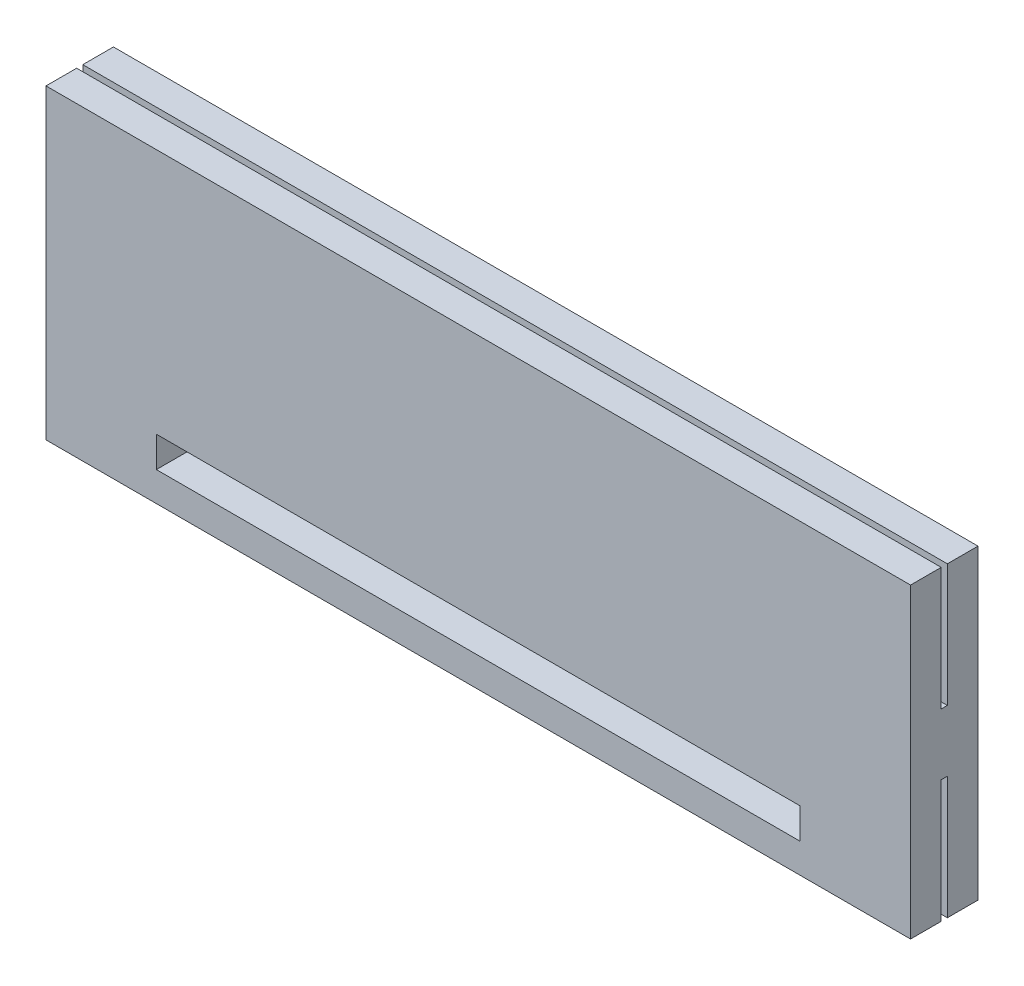
ISO-10303-21;
HEADER;
FILE_DESCRIPTION(('STEP AP214'),'2;1');
FILE_NAME('part.step','',(''),(''),'','','');
FILE_SCHEMA(('AUTOMOTIVE_DESIGN { 1 0 10303 214 1 1 1 1 }'));
ENDSEC;
DATA;
#1=APPLICATION_CONTEXT('core data for automotive mechanical design processes');
#2=APPLICATION_PROTOCOL_DEFINITION('international standard','automotive_design',2000,#1);
#3=PRODUCT_CONTEXT('',#1,'mechanical');
#4=PRODUCT('Part','Part','',(#3));
#5=PRODUCT_RELATED_PRODUCT_CATEGORY('part','',(#4));
#6=PRODUCT_DEFINITION_FORMATION('','',#4);
#7=PRODUCT_DEFINITION_CONTEXT('part definition',#1,'design');
#8=PRODUCT_DEFINITION('design','',#6,#7);
#9=PRODUCT_DEFINITION_SHAPE('','',#8);
#10=(LENGTH_UNIT() NAMED_UNIT(*) SI_UNIT(.MILLI.,.METRE.));
#11=(NAMED_UNIT(*) PLANE_ANGLE_UNIT() SI_UNIT($,.RADIAN.));
#12=(NAMED_UNIT(*) SI_UNIT($,.STERADIAN.) SOLID_ANGLE_UNIT());
#13=UNCERTAINTY_MEASURE_WITH_UNIT(LENGTH_MEASURE(1.E-05),#10,'distance_accuracy_value','');
#14=(GEOMETRIC_REPRESENTATION_CONTEXT(3) GLOBAL_UNCERTAINTY_ASSIGNED_CONTEXT((#13)) GLOBAL_UNIT_ASSIGNED_CONTEXT((#10,
#11,#12)) REPRESENTATION_CONTEXT('',''));
#15=CARTESIAN_POINT('',(0.,0.,0.));
#16=DIRECTION('',(0.,0.,1.));
#17=DIRECTION('',(1.,0.,0.));
#18=AXIS2_PLACEMENT_3D('',#15,#16,#17);
#19=CARTESIAN_POINT('',(293.391405889362,-240.,-12.));
#20=DIRECTION('',(0.,1.,0.));
#21=DIRECTION('',(0.,0.,1.));
#22=AXIS2_PLACEMENT_3D('',#19,#20,#21);
#23=PLANE('',#22);
#24=DIRECTION('',(1.,0.,0.));
#25=VECTOR('',#24,1.);
#26=CARTESIAN_POINT('',(293.391405889362,-240.,-2.00000000000019));
#27=LINE('',#26,#25);
#28=CARTESIAN_POINT('',(-141.,-240.,-2.00000000000176));
#29=VERTEX_POINT('',#28);
#30=CARTESIAN_POINT('',(141.,-240.,-2.00000000000019));
#31=VERTEX_POINT('',#30);
#32=EDGE_CURVE('E230',#29,#31,#27,.T.);
#33=ORIENTED_EDGE('',*,*,#32,.F.);
#34=DIRECTION('',(0.,0.,-1.));
#35=VECTOR('',#34,1.);
#36=CARTESIAN_POINT('',(-141.,-240.,-12.));
#37=LINE('',#36,#35);
#38=CARTESIAN_POINT('',(-141.,-240.,-12.));
#39=VERTEX_POINT('',#38);
#40=EDGE_CURVE('E274',#29,#39,#37,.T.);
#41=ORIENTED_EDGE('',*,*,#40,.T.);
#42=DIRECTION('',(-1.,0.,0.));
#43=VECTOR('',#42,1.);
#44=CARTESIAN_POINT('',(293.391405889362,-240.,-12.));
#45=LINE('',#44,#43);
#46=CARTESIAN_POINT('',(141.,-240.,-12.));
#47=VERTEX_POINT('',#46);
#48=EDGE_CURVE('E270',#47,#39,#45,.T.);
#49=ORIENTED_EDGE('',*,*,#48,.F.);
#50=DIRECTION('',(0.,0.,-1.));
#51=VECTOR('',#50,1.);
#52=CARTESIAN_POINT('',(141.,-240.,-12.));
#53=LINE('',#52,#51);
#54=EDGE_CURVE('E291',#31,#47,#53,.T.);
#55=ORIENTED_EDGE('',*,*,#54,.F.);
#56=EDGE_LOOP('',(#33,#41,#49,#55));
#57=FACE_BOUND('',#56,.T.);
#58=ADVANCED_FACE('F33',(#57),#23,.F.);
#59=CARTESIAN_POINT('',(293.391405889362,-140.,-12.));
#60=DIRECTION('',(0.,-1.,0.));
#61=DIRECTION('',(0.,0.,-1.));
#62=AXIS2_PLACEMENT_3D('',#59,#60,#61);
#63=PLANE('',#62);
#64=DIRECTION('',(-1.,0.,0.));
#65=VECTOR('',#64,1.);
#66=CARTESIAN_POINT('',(293.391405889362,-140.,-2.));
#67=LINE('',#66,#65);
#68=CARTESIAN_POINT('',(141.,-140.,-2.));
#69=VERTEX_POINT('',#68);
#70=CARTESIAN_POINT('',(-141.,-140.,-2.));
#71=VERTEX_POINT('',#70);
#72=EDGE_CURVE('E248',#69,#71,#67,.T.);
#73=ORIENTED_EDGE('',*,*,#72,.F.);
#74=DIRECTION('',(0.,0.,1.));
#75=VECTOR('',#74,1.);
#76=CARTESIAN_POINT('',(141.,-140.,-12.));
#77=LINE('',#76,#75);
#78=CARTESIAN_POINT('',(141.,-140.,-12.));
#79=VERTEX_POINT('',#78);
#80=EDGE_CURVE('E281',#79,#69,#77,.T.);
#81=ORIENTED_EDGE('',*,*,#80,.F.);
#82=DIRECTION('',(-1.,0.,0.));
#83=VECTOR('',#82,1.);
#84=CARTESIAN_POINT('',(293.391405889362,-140.,-12.));
#85=LINE('',#84,#83);
#86=CARTESIAN_POINT('',(-141.,-140.,-12.));
#87=VERTEX_POINT('',#86);
#88=EDGE_CURVE('E292',#79,#87,#85,.T.);
#89=ORIENTED_EDGE('',*,*,#88,.T.);
#90=DIRECTION('',(0.,0.,1.));
#91=VECTOR('',#90,1.);
#92=CARTESIAN_POINT('',(-141.,-140.,-12.));
#93=LINE('',#92,#91);
#94=EDGE_CURVE('E263',#87,#71,#93,.T.);
#95=ORIENTED_EDGE('',*,*,#94,.T.);
#96=EDGE_LOOP('',(#73,#81,#89,#95));
#97=FACE_BOUND('',#96,.T.);
#98=ADVANCED_FACE('F339',(#97),#63,.F.);
#99=CARTESIAN_POINT('',(293.391405889362,-140.,-12.));
#100=DIRECTION('',(0.,0.,1.));
#101=DIRECTION('',(0.,-1.,0.));
#102=AXIS2_PLACEMENT_3D('',#99,#100,#101);
#103=PLANE('',#102);
#104=DIRECTION('',(0.,1.,0.));
#105=VECTOR('',#104,1.);
#106=CARTESIAN_POINT('',(105.,-220.386342941198,-12.));
#107=LINE('',#106,#105);
#108=CARTESIAN_POINT('',(105.,-230.386342941199,-12.));
#109=VERTEX_POINT('',#108);
#110=CARTESIAN_POINT('',(105.,-220.386342941198,-12.));
#111=VERTEX_POINT('',#110);
#112=EDGE_CURVE('E189',#109,#111,#107,.T.);
#113=ORIENTED_EDGE('',*,*,#112,.T.);
#114=DIRECTION('',(-1.,0.,0.));
#115=VECTOR('',#114,1.);
#116=CARTESIAN_POINT('',(-105.,-220.386342941199,-12.));
#117=LINE('',#116,#115);
#118=CARTESIAN_POINT('',(-105.,-220.386342941198,-12.));
#119=VERTEX_POINT('',#118);
#120=EDGE_CURVE('E48',#111,#119,#117,.T.);
#121=ORIENTED_EDGE('',*,*,#120,.T.);
#122=DIRECTION('',(0.,-1.,0.));
#123=VECTOR('',#122,1.);
#124=CARTESIAN_POINT('',(-105.,-230.386342941198,-12.));
#125=LINE('',#124,#123);
#126=CARTESIAN_POINT('',(-105.,-230.386342941199,-12.));
#127=VERTEX_POINT('',#126);
#128=EDGE_CURVE('E175',#119,#127,#125,.T.);
#129=ORIENTED_EDGE('',*,*,#128,.T.);
#130=DIRECTION('',(1.,0.,0.));
#131=VECTOR('',#130,1.);
#132=CARTESIAN_POINT('',(105.,-230.386342941199,-12.));
#133=LINE('',#132,#131);
#134=EDGE_CURVE('E183',#127,#109,#133,.T.);
#135=ORIENTED_EDGE('',*,*,#134,.T.);
#136=EDGE_LOOP('',(#113,#121,#129,#135));
#137=FACE_BOUND('',#136,.T.);
#138=DIRECTION('',(0.,1.,0.));
#139=VECTOR('',#138,1.);
#140=CARTESIAN_POINT('',(141.,-140.,-12.));
#141=LINE('',#140,#139);
#142=EDGE_CURVE('E285',#47,#79,#141,.T.);
#143=ORIENTED_EDGE('',*,*,#142,.F.);
#144=ORIENTED_EDGE('',*,*,#48,.T.);
#145=DIRECTION('',(0.,1.,0.));
#146=VECTOR('',#145,1.);
#147=CARTESIAN_POINT('',(-141.,-140.,-12.));
#148=LINE('',#147,#146);
#149=EDGE_CURVE('E267',#39,#87,#148,.T.);
#150=ORIENTED_EDGE('',*,*,#149,.T.);
#151=ORIENTED_EDGE('',*,*,#88,.F.);
#152=EDGE_LOOP('',(#143,#144,#150,#151));
#153=FACE_BOUND('',#152,.T.);
#154=ADVANCED_FACE('F191',(#137,#153),#103,.F.);
#155=CARTESIAN_POINT('',(141.,-140.,0.));
#156=VERTEX_POINT('',#155);
#157=CARTESIAN_POINT('',(141.,-140.,9.99999999999998));
#158=VERTEX_POINT('',#157);
#159=EDGE_CURVE('E284',#156,#158,#77,.T.);
#160=ORIENTED_EDGE('',*,*,#159,.F.);
#161=DIRECTION('',(-1.,0.,0.));
#162=VECTOR('',#161,1.);
#163=CARTESIAN_POINT('',(293.391405889362,-140.,0.));
#164=LINE('',#163,#162);
#165=CARTESIAN_POINT('',(-141.,-140.,0.));
#166=VERTEX_POINT('',#165);
#167=EDGE_CURVE('E257',#156,#166,#164,.T.);
#168=ORIENTED_EDGE('',*,*,#167,.T.);
#169=CARTESIAN_POINT('',(-141.,-140.,9.99999999999998));
#170=VERTEX_POINT('',#169);
#171=EDGE_CURVE('E262',#166,#170,#93,.T.);
#172=ORIENTED_EDGE('',*,*,#171,.T.);
#173=DIRECTION('',(-1.,0.,0.));
#174=VECTOR('',#173,1.);
#175=CARTESIAN_POINT('',(293.391405889362,-140.,9.99999999999998));
#176=LINE('',#175,#174);
#177=EDGE_CURVE('E294',#158,#170,#176,.T.);
#178=ORIENTED_EDGE('',*,*,#177,.F.);
#179=EDGE_LOOP('',(#160,#168,#172,#178));
#180=FACE_BOUND('',#179,.T.);
#181=ADVANCED_FACE('F348',(#180),#63,.F.);
#182=CARTESIAN_POINT('',(293.391405889362,-140.,9.99999999999998));
#183=DIRECTION('',(0.,0.,-1.));
#184=DIRECTION('',(0.,1.,0.));
#185=AXIS2_PLACEMENT_3D('',#182,#183,#184);
#186=PLANE('',#185);
#187=DIRECTION('',(0.,-1.,0.));
#188=VECTOR('',#187,1.);
#189=CARTESIAN_POINT('',(-105.,-230.3863429412,9.99999999999995));
#190=LINE('',#189,#188);
#191=CARTESIAN_POINT('',(-105.,-220.386342941199,9.99999999999996));
#192=VERTEX_POINT('',#191);
#193=CARTESIAN_POINT('',(-105.,-230.386342941199,9.99999999999995));
#194=VERTEX_POINT('',#193);
#195=EDGE_CURVE('E199',#192,#194,#190,.T.);
#196=ORIENTED_EDGE('',*,*,#195,.F.);
#197=DIRECTION('',(-1.,0.,0.));
#198=VECTOR('',#197,1.);
#199=CARTESIAN_POINT('',(-105.,-220.386342941199,9.99999999999995));
#200=LINE('',#199,#198);
#201=CARTESIAN_POINT('',(105.,-220.386342941199,9.99999999999995));
#202=VERTEX_POINT('',#201);
#203=EDGE_CURVE('E202',#202,#192,#200,.T.);
#204=ORIENTED_EDGE('',*,*,#203,.F.);
#205=DIRECTION('',(0.,1.,0.));
#206=VECTOR('',#205,1.);
#207=CARTESIAN_POINT('',(105.,-220.3863429412,9.99999999999995));
#208=LINE('',#207,#206);
#209=CARTESIAN_POINT('',(105.,-230.386342941199,9.99999999999996));
#210=VERTEX_POINT('',#209);
#211=EDGE_CURVE('E204',#210,#202,#208,.T.);
#212=ORIENTED_EDGE('',*,*,#211,.F.);
#213=DIRECTION('',(1.,0.,0.));
#214=VECTOR('',#213,1.);
#215=CARTESIAN_POINT('',(105.,-230.386342941199,9.99999999999995));
#216=LINE('',#215,#214);
#217=EDGE_CURVE('E197',#194,#210,#216,.T.);
#218=ORIENTED_EDGE('',*,*,#217,.F.);
#219=EDGE_LOOP('',(#196,#204,#212,#218));
#220=FACE_BOUND('',#219,.T.);
#221=DIRECTION('',(0.,-1.,0.));
#222=VECTOR('',#221,1.);
#223=CARTESIAN_POINT('',(141.,-140.,9.99999999999998));
#224=LINE('',#223,#222);
#225=CARTESIAN_POINT('',(141.,-240.,9.99999999999995));
#226=VERTEX_POINT('',#225);
#227=EDGE_CURVE('E277',#158,#226,#224,.T.);
#228=ORIENTED_EDGE('',*,*,#227,.F.);
#229=ORIENTED_EDGE('',*,*,#177,.T.);
#230=DIRECTION('',(0.,-1.,0.));
#231=VECTOR('',#230,1.);
#232=CARTESIAN_POINT('',(-141.,-140.,9.99999999999998));
#233=LINE('',#232,#231);
#234=CARTESIAN_POINT('',(-141.,-240.,9.99999999999995));
#235=VERTEX_POINT('',#234);
#236=EDGE_CURVE('E266',#170,#235,#233,.T.);
#237=ORIENTED_EDGE('',*,*,#236,.T.);
#238=DIRECTION('',(-1.,0.,0.));
#239=VECTOR('',#238,1.);
#240=CARTESIAN_POINT('',(293.391405889362,-240.,9.99999999999995));
#241=LINE('',#240,#239);
#242=EDGE_CURVE('E297',#226,#235,#241,.T.);
#243=ORIENTED_EDGE('',*,*,#242,.F.);
#244=EDGE_LOOP('',(#228,#229,#237,#243));
#245=FACE_BOUND('',#244,.T.);
#246=ADVANCED_FACE('F353',(#220,#245),#186,.F.);
#247=CARTESIAN_POINT('',(-141.,-240.,-1.89163709932799E-13));
#248=VERTEX_POINT('',#247);
#249=EDGE_CURVE('E271',#235,#248,#37,.T.);
#250=ORIENTED_EDGE('',*,*,#249,.T.);
#251=DIRECTION('',(1.,0.,0.));
#252=VECTOR('',#251,1.);
#253=CARTESIAN_POINT('',(293.391405889362,-240.,-1.90819582357449E-13));
#254=LINE('',#253,#252);
#255=CARTESIAN_POINT('',(141.,-240.,-1.90819586702168E-13));
#256=VERTEX_POINT('',#255);
#257=EDGE_CURVE('E239',#248,#256,#254,.T.);
#258=ORIENTED_EDGE('',*,*,#257,.T.);
#259=EDGE_CURVE('E288',#226,#256,#53,.T.);
#260=ORIENTED_EDGE('',*,*,#259,.F.);
#261=ORIENTED_EDGE('',*,*,#242,.T.);
#262=EDGE_LOOP('',(#250,#258,#260,#261));
#263=FACE_BOUND('',#262,.T.);
#264=ADVANCED_FACE('F342',(#263),#23,.F.);
#265=CARTESIAN_POINT('',(141.,-180.,-2.));
#266=DIRECTION('',(1.,0.,0.));
#267=DIRECTION('',(0.,0.,-1.));
#268=AXIS2_PLACEMENT_3D('',#265,#266,#267);
#269=PLANE('',#268);
#270=DIRECTION('',(0.,-1.,0.));
#271=VECTOR('',#270,1.);
#272=CARTESIAN_POINT('',(141.,-180.,0.));
#273=LINE('',#272,#271);
#274=CARTESIAN_POINT('',(141.,-200.,0.));
#275=VERTEX_POINT('',#274);
#276=EDGE_CURVE('E242',#275,#256,#273,.T.);
#277=ORIENTED_EDGE('',*,*,#276,.F.);
#278=DIRECTION('',(0.,0.,1.));
#279=VECTOR('',#278,1.);
#280=CARTESIAN_POINT('',(141.,-200.,-2.00000000000008));
#281=LINE('',#280,#279);
#282=CARTESIAN_POINT('',(141.,-200.,-2.00000000000004));
#283=VERTEX_POINT('',#282);
#284=EDGE_CURVE('E237',#283,#275,#281,.T.);
#285=ORIENTED_EDGE('',*,*,#284,.F.);
#286=DIRECTION('',(0.,-1.,0.));
#287=VECTOR('',#286,1.);
#288=CARTESIAN_POINT('',(141.,-180.,-2.));
#289=LINE('',#288,#287);
#290=EDGE_CURVE('E234',#283,#31,#289,.T.);
#291=ORIENTED_EDGE('',*,*,#290,.T.);
#292=ORIENTED_EDGE('',*,*,#54,.T.);
#293=ORIENTED_EDGE('',*,*,#142,.T.);
#294=ORIENTED_EDGE('',*,*,#80,.T.);
#295=DIRECTION('',(0.,-1.,0.));
#296=VECTOR('',#295,1.);
#297=CARTESIAN_POINT('',(141.,-180.,-2.));
#298=LINE('',#297,#296);
#299=CARTESIAN_POINT('',(141.,-180.,-2.));
#300=VERTEX_POINT('',#299);
#301=EDGE_CURVE('E252',#69,#300,#298,.T.);
#302=ORIENTED_EDGE('',*,*,#301,.T.);
#303=DIRECTION('',(0.,0.,-1.));
#304=VECTOR('',#303,1.);
#305=CARTESIAN_POINT('',(141.,-180.,-2.));
#306=LINE('',#305,#304);
#307=CARTESIAN_POINT('',(141.,-180.,0.));
#308=VERTEX_POINT('',#307);
#309=EDGE_CURVE('E255',#308,#300,#306,.T.);
#310=ORIENTED_EDGE('',*,*,#309,.F.);
#311=DIRECTION('',(0.,-1.,0.));
#312=VECTOR('',#311,1.);
#313=CARTESIAN_POINT('',(141.,-180.,0.));
#314=LINE('',#313,#312);
#315=EDGE_CURVE('E260',#156,#308,#314,.T.);
#316=ORIENTED_EDGE('',*,*,#315,.F.);
#317=ORIENTED_EDGE('',*,*,#159,.T.);
#318=ORIENTED_EDGE('',*,*,#227,.T.);
#319=ORIENTED_EDGE('',*,*,#259,.T.);
#320=EDGE_LOOP('',(#277,#285,#291,#292,#293,#294,#302,#310,#316,#317,#318,#319));
#321=FACE_BOUND('',#320,.T.);
#322=ADVANCED_FACE('F35',(#321),#269,.T.);
#323=CARTESIAN_POINT('',(-141.,225.,-2.));
#324=DIRECTION('',(-1.,0.,0.));
#325=DIRECTION('',(0.,0.,1.));
#326=AXIS2_PLACEMENT_3D('',#323,#324,#325);
#327=PLANE('',#326);
#328=DIRECTION('',(0.,1.,0.));
#329=VECTOR('',#328,1.);
#330=CARTESIAN_POINT('',(-141.,225.,1.570792107497E-12));
#331=LINE('',#330,#329);
#332=CARTESIAN_POINT('',(-141.,-200.,0.));
#333=VERTEX_POINT('',#332);
#334=EDGE_CURVE('E313',#248,#333,#331,.T.);
#335=ORIENTED_EDGE('',*,*,#334,.F.);
#336=ORIENTED_EDGE('',*,*,#249,.F.);
#337=ORIENTED_EDGE('',*,*,#236,.F.);
#338=ORIENTED_EDGE('',*,*,#171,.F.);
#339=DIRECTION('',(0.,1.,0.));
#340=VECTOR('',#339,1.);
#341=CARTESIAN_POINT('',(-141.,225.,0.));
#342=LINE('',#341,#340);
#343=CARTESIAN_POINT('',(-141.,-180.,0.));
#344=VERTEX_POINT('',#343);
#345=EDGE_CURVE('E305',#344,#166,#342,.T.);
#346=ORIENTED_EDGE('',*,*,#345,.F.);
#347=DIRECTION('',(0.,0.,1.));
#348=VECTOR('',#347,1.);
#349=CARTESIAN_POINT('',(-141.,-180.,-2.));
#350=LINE('',#349,#348);
#351=CARTESIAN_POINT('',(-141.,-180.,-2.));
#352=VERTEX_POINT('',#351);
#353=EDGE_CURVE('E303',#352,#344,#350,.T.);
#354=ORIENTED_EDGE('',*,*,#353,.F.);
#355=DIRECTION('',(0.,1.,0.));
#356=VECTOR('',#355,1.);
#357=CARTESIAN_POINT('',(-141.,225.,-2.));
#358=LINE('',#357,#356);
#359=EDGE_CURVE('E280',#352,#71,#358,.T.);
#360=ORIENTED_EDGE('',*,*,#359,.T.);
#361=ORIENTED_EDGE('',*,*,#94,.F.);
#362=ORIENTED_EDGE('',*,*,#149,.F.);
#363=ORIENTED_EDGE('',*,*,#40,.F.);
#364=DIRECTION('',(0.,1.,0.));
#365=VECTOR('',#364,1.);
#366=CARTESIAN_POINT('',(-141.,225.,-2.));
#367=LINE('',#366,#365);
#368=CARTESIAN_POINT('',(-141.,-200.,-2.00000000000161));
#369=VERTEX_POINT('',#368);
#370=EDGE_CURVE('E307',#29,#369,#367,.T.);
#371=ORIENTED_EDGE('',*,*,#370,.T.);
#372=DIRECTION('',(0.,0.,-1.));
#373=VECTOR('',#372,1.);
#374=CARTESIAN_POINT('',(-141.,-200.,-2.00000000000161));
#375=LINE('',#374,#373);
#376=EDGE_CURVE('E310',#333,#369,#375,.T.);
#377=ORIENTED_EDGE('',*,*,#376,.F.);
#378=EDGE_LOOP('',(#335,#336,#337,#338,#346,#354,#360,#361,#362,#363,#371,#377));
#379=FACE_BOUND('',#378,.T.);
#380=ADVANCED_FACE('F359',(#379),#327,.T.);
#381=CARTESIAN_POINT('',(0.,0.,0.));
#382=DIRECTION('',(0.,0.,1.));
#383=DIRECTION('',(1.,0.,0.));
#384=AXIS2_PLACEMENT_3D('',#381,#382,#383);
#385=PLANE('',#384);
#386=ORIENTED_EDGE('',*,*,#315,.T.);
#387=DIRECTION('',(1.,0.,0.));
#388=VECTOR('',#387,1.);
#389=CARTESIAN_POINT('',(-191.,-180.,0.));
#390=LINE('',#389,#388);
#391=EDGE_CURVE('E244',#344,#308,#390,.T.);
#392=ORIENTED_EDGE('',*,*,#391,.F.);
#393=ORIENTED_EDGE('',*,*,#345,.T.);
#394=ORIENTED_EDGE('',*,*,#167,.F.);
#395=EDGE_LOOP('',(#386,#392,#393,#394));
#396=FACE_BOUND('',#395,.T.);
#397=ADVANCED_FACE('F378',(#396),#385,.F.);
#398=CARTESIAN_POINT('',(-191.,-180.,-2.));
#399=DIRECTION('',(0.,-1.,0.));
#400=DIRECTION('',(0.,0.,1.));
#401=AXIS2_PLACEMENT_3D('',#398,#399,#400);
#402=PLANE('',#401);
#403=ORIENTED_EDGE('',*,*,#309,.T.);
#404=DIRECTION('',(1.,0.,0.));
#405=VECTOR('',#404,1.);
#406=CARTESIAN_POINT('',(-191.,-180.,-2.));
#407=LINE('',#406,#405);
#408=EDGE_CURVE('E245',#352,#300,#407,.T.);
#409=ORIENTED_EDGE('',*,*,#408,.F.);
#410=ORIENTED_EDGE('',*,*,#353,.T.);
#411=ORIENTED_EDGE('',*,*,#391,.T.);
#412=EDGE_LOOP('',(#403,#409,#410,#411));
#413=FACE_BOUND('',#412,.T.);
#414=ADVANCED_FACE('F382',(#413),#402,.F.);
#415=CARTESIAN_POINT('',(0.,0.,-2.));
#416=DIRECTION('',(0.,0.,1.));
#417=DIRECTION('',(1.,0.,0.));
#418=AXIS2_PLACEMENT_3D('',#415,#416,#417);
#419=PLANE('',#418);
#420=ORIENTED_EDGE('',*,*,#72,.T.);
#421=ORIENTED_EDGE('',*,*,#359,.F.);
#422=ORIENTED_EDGE('',*,*,#408,.T.);
#423=ORIENTED_EDGE('',*,*,#301,.F.);
#424=EDGE_LOOP('',(#420,#421,#422,#423));
#425=FACE_BOUND('',#424,.T.);
#426=ADVANCED_FACE('F387',(#425),#419,.T.);
#427=CARTESIAN_POINT('',(0.,-380.,-7.19121731859478E-13));
#428=DIRECTION('',(0.,0.,1.));
#429=DIRECTION('',(1.,0.,0.));
#430=AXIS2_PLACEMENT_3D('',#427,#428,#429);
#431=PLANE('',#430);
#432=DIRECTION('',(0.,1.,0.));
#433=VECTOR('',#432,1.);
#434=CARTESIAN_POINT('',(105.,-380.,-7.191217288659E-13));
#435=LINE('',#434,#433);
#436=CARTESIAN_POINT('',(105.,-230.386342941199,-1.38777878078145E-13));
#437=VERTEX_POINT('',#436);
#438=CARTESIAN_POINT('',(105.,-220.386342941198,-1.15007784173679E-13));
#439=VERTEX_POINT('',#438);
#440=EDGE_CURVE('E214',#437,#439,#435,.T.);
#441=ORIENTED_EDGE('',*,*,#440,.T.);
#442=DIRECTION('',(-1.,0.,0.));
#443=VECTOR('',#442,1.);
#444=CARTESIAN_POINT('',(0.,-220.386342941199,-1.1500778716726E-13));
#445=LINE('',#444,#443);
#446=CARTESIAN_POINT('',(-105.,-220.386342941199,-1.38777878078145E-13));
#447=VERTEX_POINT('',#446);
#448=EDGE_CURVE('E223',#439,#447,#445,.T.);
#449=ORIENTED_EDGE('',*,*,#448,.T.);
#450=DIRECTION('',(0.,-1.,0.));
#451=VECTOR('',#450,1.);
#452=CARTESIAN_POINT('',(-105.,-380.,-7.19121734853056E-13));
#453=LINE('',#452,#451);
#454=CARTESIAN_POINT('',(-105.,-230.386342941199,-1.66533453693773E-13));
#455=VERTEX_POINT('',#454);
#456=EDGE_CURVE('E220',#447,#455,#453,.T.);
#457=ORIENTED_EDGE('',*,*,#456,.T.);
#458=DIRECTION('',(1.,0.,0.));
#459=VECTOR('',#458,1.);
#460=CARTESIAN_POINT('',(0.,-230.386342941199,-1.52856299370051E-13));
#461=LINE('',#460,#459);
#462=EDGE_CURVE('E217',#455,#437,#461,.T.);
#463=ORIENTED_EDGE('',*,*,#462,.T.);
#464=EDGE_LOOP('',(#441,#449,#457,#463));
#465=FACE_BOUND('',#464,.T.);
#466=ORIENTED_EDGE('',*,*,#276,.T.);
#467=ORIENTED_EDGE('',*,*,#257,.F.);
#468=ORIENTED_EDGE('',*,*,#334,.T.);
#469=DIRECTION('',(1.,0.,0.));
#470=VECTOR('',#469,1.);
#471=CARTESIAN_POINT('',(-191.,-200.,0.));
#472=LINE('',#471,#470);
#473=EDGE_CURVE('E226',#333,#275,#472,.T.);
#474=ORIENTED_EDGE('',*,*,#473,.T.);
#475=EDGE_LOOP('',(#466,#467,#468,#474));
#476=FACE_BOUND('',#475,.T.);
#477=ADVANCED_FACE('F400',(#465,#476),#431,.F.);
#478=CARTESIAN_POINT('',(-191.,-200.,-2.00000000000004));
#479=DIRECTION('',(0.,1.,0.));
#480=DIRECTION('',(0.,0.,1.));
#481=AXIS2_PLACEMENT_3D('',#478,#479,#480);
#482=PLANE('',#481);
#483=ORIENTED_EDGE('',*,*,#284,.T.);
#484=ORIENTED_EDGE('',*,*,#473,.F.);
#485=ORIENTED_EDGE('',*,*,#376,.T.);
#486=DIRECTION('',(1.,0.,0.));
#487=VECTOR('',#486,1.);
#488=CARTESIAN_POINT('',(-191.,-200.,-2.00000000000004));
#489=LINE('',#488,#487);
#490=EDGE_CURVE('E227',#369,#283,#489,.T.);
#491=ORIENTED_EDGE('',*,*,#490,.T.);
#492=EDGE_LOOP('',(#483,#484,#485,#491));
#493=FACE_BOUND('',#492,.T.);
#494=ADVANCED_FACE('F398',(#493),#482,.F.);
#495=CARTESIAN_POINT('',(0.,-380.,-2.00000000000072));
#496=DIRECTION('',(0.,0.,1.));
#497=DIRECTION('',(1.,0.,0.));
#498=AXIS2_PLACEMENT_3D('',#495,#496,#497);
#499=PLANE('',#498);
#500=DIRECTION('',(-1.,0.,0.));
#501=VECTOR('',#500,1.);
#502=CARTESIAN_POINT('',(0.,-220.386342941199,-2.00000000000012));
#503=LINE('',#502,#501);
#504=CARTESIAN_POINT('',(105.,-220.386342941199,-2.00000000000014));
#505=VERTEX_POINT('',#504);
#506=CARTESIAN_POINT('',(-105.,-220.386342941199,-2.00000000000014));
#507=VERTEX_POINT('',#506);
#508=EDGE_CURVE('E11',#505,#507,#503,.T.);
#509=ORIENTED_EDGE('',*,*,#508,.F.);
#510=DIRECTION('',(0.,1.,0.));
#511=VECTOR('',#510,1.);
#512=CARTESIAN_POINT('',(105.,-380.,-2.00000000000072));
#513=LINE('',#512,#511);
#514=CARTESIAN_POINT('',(105.,-230.386342941199,-2.00000000000015));
#515=VERTEX_POINT('',#514);
#516=EDGE_CURVE('E315',#515,#505,#513,.T.);
#517=ORIENTED_EDGE('',*,*,#516,.F.);
#518=DIRECTION('',(1.,0.,0.));
#519=VECTOR('',#518,1.);
#520=CARTESIAN_POINT('',(0.,-230.386342941199,-2.00000000000015));
#521=LINE('',#520,#519);
#522=CARTESIAN_POINT('',(-105.,-230.386342941199,-2.00000000000014));
#523=VERTEX_POINT('',#522);
#524=EDGE_CURVE('E317',#523,#515,#521,.T.);
#525=ORIENTED_EDGE('',*,*,#524,.F.);
#526=DIRECTION('',(0.,-1.,0.));
#527=VECTOR('',#526,1.);
#528=CARTESIAN_POINT('',(-105.,-380.,-2.00000000000072));
#529=LINE('',#528,#527);
#530=EDGE_CURVE('E41',#507,#523,#529,.T.);
#531=ORIENTED_EDGE('',*,*,#530,.F.);
#532=EDGE_LOOP('',(#509,#517,#525,#531));
#533=FACE_BOUND('',#532,.T.);
#534=ORIENTED_EDGE('',*,*,#490,.F.);
#535=ORIENTED_EDGE('',*,*,#370,.F.);
#536=ORIENTED_EDGE('',*,*,#32,.T.);
#537=ORIENTED_EDGE('',*,*,#290,.F.);
#538=EDGE_LOOP('',(#534,#535,#536,#537));
#539=FACE_BOUND('',#538,.T.);
#540=ADVANCED_FACE('F321',(#533,#539),#499,.T.);
#541=CARTESIAN_POINT('',(105.,-220.3863429412,220.237960416286));
#542=DIRECTION('',(1.,0.,0.));
#543=DIRECTION('',(0.,0.,-1.));
#544=AXIS2_PLACEMENT_3D('',#541,#542,#543);
#545=PLANE('',#544);
#546=ORIENTED_EDGE('',*,*,#516,.T.);
#547=DIRECTION('',(0.,0.,-1.));
#548=VECTOR('',#547,1.);
#549=CARTESIAN_POINT('',(105.,-220.3863429412,220.237960416286));
#550=LINE('',#549,#548);
#551=EDGE_CURVE('E212',#505,#111,#550,.T.);
#552=ORIENTED_EDGE('',*,*,#551,.T.);
#553=ORIENTED_EDGE('',*,*,#112,.F.);
#554=DIRECTION('',(0.,0.,-1.));
#555=VECTOR('',#554,1.);
#556=CARTESIAN_POINT('',(105.,-230.3863429412,220.237960416286));
#557=LINE('',#556,#555);
#558=EDGE_CURVE('E185',#515,#109,#557,.T.);
#559=ORIENTED_EDGE('',*,*,#558,.F.);
#560=EDGE_LOOP('',(#546,#552,#553,#559));
#561=FACE_BOUND('',#560,.T.);
#562=ADVANCED_FACE('F324',(#561),#545,.F.);
#563=CARTESIAN_POINT('',(105.,-230.3863429412,220.237960416286));
#564=DIRECTION('',(0.,-1.,0.));
#565=DIRECTION('',(0.,0.,-1.));
#566=AXIS2_PLACEMENT_3D('',#563,#564,#565);
#567=PLANE('',#566);
#568=ORIENTED_EDGE('',*,*,#524,.T.);
#569=ORIENTED_EDGE('',*,*,#558,.T.);
#570=ORIENTED_EDGE('',*,*,#134,.F.);
#571=DIRECTION('',(0.,0.,-1.));
#572=VECTOR('',#571,1.);
#573=CARTESIAN_POINT('',(-105.,-230.3863429412,220.237960416286));
#574=LINE('',#573,#572);
#575=EDGE_CURVE('E170',#523,#127,#574,.T.);
#576=ORIENTED_EDGE('',*,*,#575,.F.);
#577=EDGE_LOOP('',(#568,#569,#570,#576));
#578=FACE_BOUND('',#577,.T.);
#579=ADVANCED_FACE('F184',(#578),#567,.F.);
#580=CARTESIAN_POINT('',(-105.,-230.3863429412,220.237960416286));
#581=DIRECTION('',(-1.,0.,0.));
#582=DIRECTION('',(0.,0.,1.));
#583=AXIS2_PLACEMENT_3D('',#580,#581,#582);
#584=PLANE('',#583);
#585=ORIENTED_EDGE('',*,*,#530,.T.);
#586=ORIENTED_EDGE('',*,*,#575,.T.);
#587=ORIENTED_EDGE('',*,*,#128,.F.);
#588=DIRECTION('',(0.,0.,-1.));
#589=VECTOR('',#588,1.);
#590=CARTESIAN_POINT('',(-105.,-220.3863429412,220.237960416286));
#591=LINE('',#590,#589);
#592=EDGE_CURVE('E206',#507,#119,#591,.T.);
#593=ORIENTED_EDGE('',*,*,#592,.F.);
#594=EDGE_LOOP('',(#585,#586,#587,#593));
#595=FACE_BOUND('',#594,.T.);
#596=ADVANCED_FACE('F172',(#595),#584,.F.);
#597=CARTESIAN_POINT('',(-105.,-220.3863429412,220.237960416286));
#598=DIRECTION('',(0.,1.,0.));
#599=DIRECTION('',(0.,0.,1.));
#600=AXIS2_PLACEMENT_3D('',#597,#598,#599);
#601=PLANE('',#600);
#602=ORIENTED_EDGE('',*,*,#508,.T.);
#603=ORIENTED_EDGE('',*,*,#592,.T.);
#604=ORIENTED_EDGE('',*,*,#120,.F.);
#605=ORIENTED_EDGE('',*,*,#551,.F.);
#606=EDGE_LOOP('',(#602,#603,#604,#605));
#607=FACE_BOUND('',#606,.T.);
#608=ADVANCED_FACE('F325',(#607),#601,.F.);
#609=EDGE_CURVE('E210',#202,#439,#550,.T.);
#610=ORIENTED_EDGE('',*,*,#609,.F.);
#611=ORIENTED_EDGE('',*,*,#203,.T.);
#612=EDGE_CURVE('E200',#192,#447,#591,.T.);
#613=ORIENTED_EDGE('',*,*,#612,.T.);
#614=ORIENTED_EDGE('',*,*,#448,.F.);
#615=EDGE_LOOP('',(#610,#611,#613,#614));
#616=FACE_BOUND('',#615,.T.);
#617=ADVANCED_FACE('F327',(#616),#601,.F.);
#618=ORIENTED_EDGE('',*,*,#612,.F.);
#619=ORIENTED_EDGE('',*,*,#195,.T.);
#620=EDGE_CURVE('E180',#194,#455,#574,.T.);
#621=ORIENTED_EDGE('',*,*,#620,.T.);
#622=ORIENTED_EDGE('',*,*,#456,.F.);
#623=EDGE_LOOP('',(#618,#619,#621,#622));
#624=FACE_BOUND('',#623,.T.);
#625=ADVANCED_FACE('F333',(#624),#584,.F.);
#626=ORIENTED_EDGE('',*,*,#620,.F.);
#627=ORIENTED_EDGE('',*,*,#217,.T.);
#628=EDGE_CURVE('E56',#210,#437,#557,.T.);
#629=ORIENTED_EDGE('',*,*,#628,.T.);
#630=ORIENTED_EDGE('',*,*,#462,.F.);
#631=EDGE_LOOP('',(#626,#627,#629,#630));
#632=FACE_BOUND('',#631,.T.);
#633=ADVANCED_FACE('F519',(#632),#567,.F.);
#634=ORIENTED_EDGE('',*,*,#628,.F.);
#635=ORIENTED_EDGE('',*,*,#211,.T.);
#636=ORIENTED_EDGE('',*,*,#609,.T.);
#637=ORIENTED_EDGE('',*,*,#440,.F.);
#638=EDGE_LOOP('',(#634,#635,#636,#637));
#639=FACE_BOUND('',#638,.T.);
#640=ADVANCED_FACE('F510',(#639),#545,.F.);
#641=CLOSED_SHELL('',(#58,#98,#154,#181,#246,#264,#322,#380,#397,#414,#426,#477,#494,#540,#562,
#579,#596,#608,#617,#625,#633,#640));
#642=MANIFOLD_SOLID_BREP('B2',#641);
#643=ADVANCED_BREP_SHAPE_REPRESENTATION('',(#18,#642),#14);
#644=SHAPE_DEFINITION_REPRESENTATION(#9,#643);
ENDSEC;
END-ISO-10303-21;
